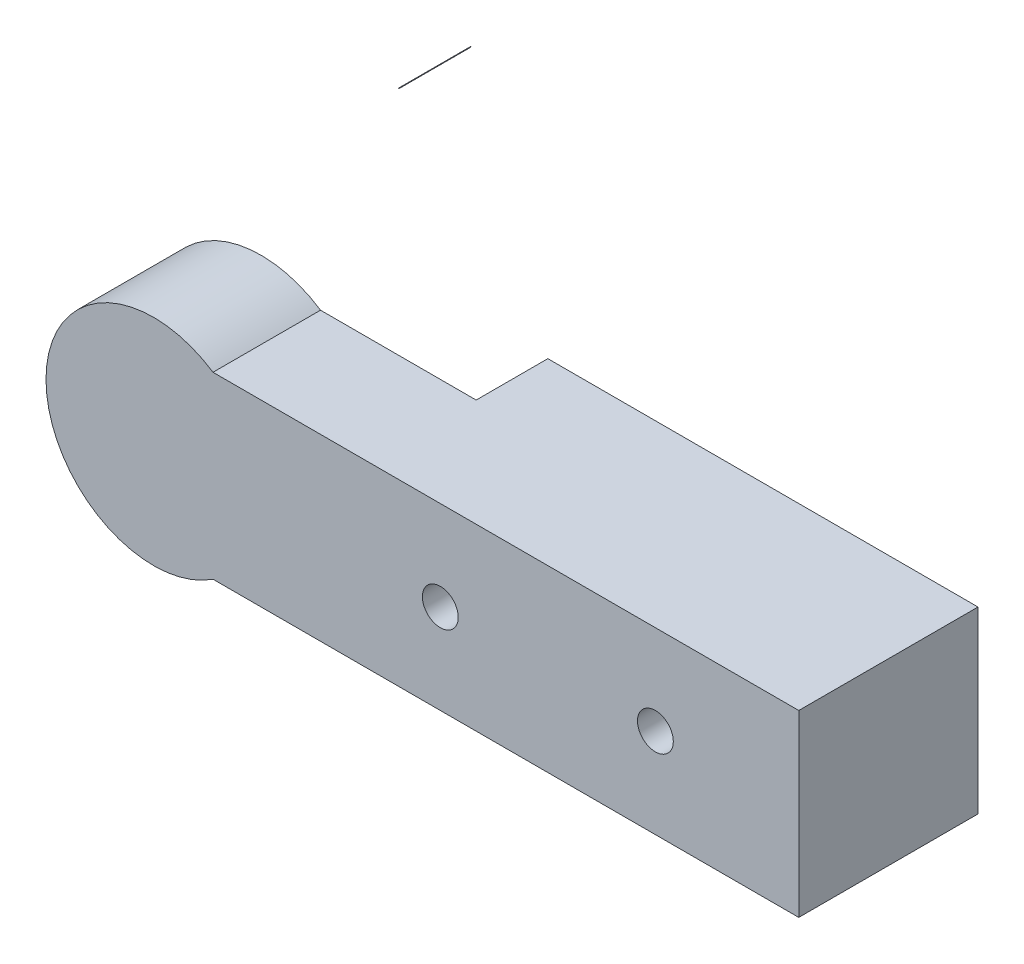
ISO-10303-21;
HEADER;
FILE_DESCRIPTION(('STEP AP214'),'2;1');
FILE_NAME('part.step','',(''),(''),'','','');
FILE_SCHEMA(('AUTOMOTIVE_DESIGN { 1 0 10303 214 1 1 1 1 }'));
ENDSEC;
DATA;
#1=APPLICATION_CONTEXT('core data for automotive mechanical design processes');
#2=APPLICATION_PROTOCOL_DEFINITION('international standard','automotive_design',2000,#1);
#3=PRODUCT_CONTEXT('',#1,'mechanical');
#4=PRODUCT('Part','Part','',(#3));
#5=PRODUCT_RELATED_PRODUCT_CATEGORY('part','',(#4));
#6=PRODUCT_DEFINITION_FORMATION('','',#4);
#7=PRODUCT_DEFINITION_CONTEXT('part definition',#1,'design');
#8=PRODUCT_DEFINITION('design','',#6,#7);
#9=PRODUCT_DEFINITION_SHAPE('','',#8);
#10=(LENGTH_UNIT() NAMED_UNIT(*) SI_UNIT(.MILLI.,.METRE.));
#11=(NAMED_UNIT(*) PLANE_ANGLE_UNIT() SI_UNIT($,.RADIAN.));
#12=(NAMED_UNIT(*) SI_UNIT($,.STERADIAN.) SOLID_ANGLE_UNIT());
#13=UNCERTAINTY_MEASURE_WITH_UNIT(LENGTH_MEASURE(1.E-05),#10,'distance_accuracy_value','');
#14=(GEOMETRIC_REPRESENTATION_CONTEXT(3) GLOBAL_UNCERTAINTY_ASSIGNED_CONTEXT((#13)) GLOBAL_UNIT_ASSIGNED_CONTEXT((#10,
#11,#12)) REPRESENTATION_CONTEXT('',''));
#15=CARTESIAN_POINT('',(0.,0.,0.));
#16=DIRECTION('',(0.,0.,1.));
#17=DIRECTION('',(1.,0.,0.));
#18=AXIS2_PLACEMENT_3D('',#15,#16,#17);
#19=CARTESIAN_POINT('',(19.2259292638255,44.7714350347894,-10.));
#20=DIRECTION('',(0.,0.,1.));
#21=DIRECTION('',(1.,0.,0.));
#22=AXIS2_PLACEMENT_3D('',#19,#20,#21);
#23=CYLINDRICAL_SURFACE('',#22,0.0357477974602727);
#24=CARTESIAN_POINT('',(19.2259292638255,44.7714350347894,-10.));
#25=DIRECTION('',(0.,0.,-1.));
#26=DIRECTION('',(-1.,0.,0.));
#27=AXIS2_PLACEMENT_3D('',#24,#25,#26);
#28=CIRCLE('',#27,0.0357477974602727);
#29=CARTESIAN_POINT('',(19.1901814663652,44.7714350347894,-10.));
#30=VERTEX_POINT('',#29);
#31=EDGE_CURVE('E11',#30,#30,#28,.T.);
#32=ORIENTED_EDGE('',*,*,#31,.F.);
#33=EDGE_LOOP('',(#32));
#34=FACE_BOUND('',#33,.T.);
#35=CARTESIAN_POINT('',(19.2259292638255,44.7714350347894,0.));
#36=DIRECTION('',(0.,0.,-1.));
#37=DIRECTION('',(-1.,0.,0.));
#38=AXIS2_PLACEMENT_3D('',#35,#36,#37);
#39=CIRCLE('',#38,0.0357477974602727);
#40=CARTESIAN_POINT('',(19.1901814663652,44.7714350347894,0.));
#41=VERTEX_POINT('',#40);
#42=EDGE_CURVE('E46',#41,#41,#39,.T.);
#43=ORIENTED_EDGE('',*,*,#42,.T.);
#44=EDGE_LOOP('',(#43));
#45=FACE_BOUND('',#44,.T.);
#46=ADVANCED_FACE('F43',(#34,#45),#23,.T.);
#47=CARTESIAN_POINT('',(19.2259292638255,44.7714350347894,-10.));
#48=DIRECTION('',(0.,0.,-1.));
#49=DIRECTION('',(-1.,0.,0.));
#50=AXIS2_PLACEMENT_3D('',#47,#48,#49);
#51=PLANE('',#50);
#52=ORIENTED_EDGE('',*,*,#31,.T.);
#53=EDGE_LOOP('',(#52));
#54=FACE_BOUND('',#53,.T.);
#55=ADVANCED_FACE('F58',(#54),#51,.T.);
#56=CARTESIAN_POINT('',(19.2259292638255,44.7714350347894,0.));
#57=DIRECTION('',(0.,0.,-1.));
#58=DIRECTION('',(-1.,0.,0.));
#59=AXIS2_PLACEMENT_3D('',#56,#57,#58);
#60=PLANE('',#59);
#61=ORIENTED_EDGE('',*,*,#42,.F.);
#62=EDGE_LOOP('',(#61));
#63=FACE_BOUND('',#62,.T.);
#64=ADVANCED_FACE('F56',(#63),#60,.F.);
#65=CLOSED_SHELL('',(#46,#55,#64));
#66=MANIFOLD_SOLID_BREP('B2',#65);
#67=CARTESIAN_POINT('',(0.,0.,0.));
#68=DIRECTION('',(0.,0.,1.));
#69=DIRECTION('',(1.,0.,0.));
#70=AXIS2_PLACEMENT_3D('',#67,#68,#69);
#71=PLANE('',#70);
#72=DIRECTION('',(0.,1.,0.));
#73=VECTOR('',#72,1.);
#74=CARTESIAN_POINT('',(30.,12.5,0.));
#75=LINE('',#74,#73);
#76=CARTESIAN_POINT('',(30.,-12.5,0.));
#77=VERTEX_POINT('',#76);
#78=CARTESIAN_POINT('',(30.,12.5,0.));
#79=VERTEX_POINT('',#78);
#80=EDGE_CURVE('E99',#77,#79,#75,.T.);
#81=ORIENTED_EDGE('',*,*,#80,.F.);
#82=DIRECTION('',(1.,0.,0.));
#83=VECTOR('',#82,1.);
#84=CARTESIAN_POINT('',(0.,-12.5,0.));
#85=LINE('',#84,#83);
#86=CARTESIAN_POINT('',(8.2915619758885,-12.5,0.));
#87=VERTEX_POINT('',#86);
#88=EDGE_CURVE('E193',#87,#77,#85,.T.);
#89=ORIENTED_EDGE('',*,*,#88,.F.);
#90=CARTESIAN_POINT('',(0.,0.,0.));
#91=DIRECTION('',(0.,0.,1.));
#92=DIRECTION('',(1.,0.,0.));
#93=AXIS2_PLACEMENT_3D('',#90,#91,#92);
#94=CIRCLE('',#93,15.);
#95=CARTESIAN_POINT('',(8.2915619758885,12.5,0.));
#96=VERTEX_POINT('',#95);
#97=EDGE_CURVE('E178',#96,#87,#94,.T.);
#98=ORIENTED_EDGE('',*,*,#97,.F.);
#99=DIRECTION('',(1.,0.,0.));
#100=VECTOR('',#99,1.);
#101=CARTESIAN_POINT('',(0.,12.5,0.));
#102=LINE('',#101,#100);
#103=EDGE_CURVE('E181',#96,#79,#102,.T.);
#104=ORIENTED_EDGE('',*,*,#103,.T.);
#105=EDGE_LOOP('',(#81,#89,#98,#104));
#106=FACE_BOUND('',#105,.T.);
#107=ADVANCED_FACE('F84',(#106),#71,.F.);
#108=CARTESIAN_POINT('',(0.,0.,15.));
#109=DIRECTION('',(0.,0.,-1.));
#110=DIRECTION('',(-1.,0.,0.));
#111=AXIS2_PLACEMENT_3D('',#108,#109,#110);
#112=CYLINDRICAL_SURFACE('',#111,15.);
#113=ORIENTED_EDGE('',*,*,#97,.T.);
#114=DIRECTION('',(0.,0.,-1.));
#115=VECTOR('',#114,1.);
#116=CARTESIAN_POINT('',(8.2915619758885,-12.5,15.));
#117=LINE('',#116,#115);
#118=CARTESIAN_POINT('',(8.2915619758885,-12.5,15.));
#119=VERTEX_POINT('',#118);
#120=EDGE_CURVE('E41',#119,#87,#117,.T.);
#121=ORIENTED_EDGE('',*,*,#120,.F.);
#122=CARTESIAN_POINT('',(0.,0.,15.));
#123=DIRECTION('',(0.,0.,1.));
#124=DIRECTION('',(1.,0.,0.));
#125=AXIS2_PLACEMENT_3D('',#122,#123,#124);
#126=CIRCLE('',#125,15.);
#127=CARTESIAN_POINT('',(8.2915619758885,12.5,15.));
#128=VERTEX_POINT('',#127);
#129=EDGE_CURVE('E179',#128,#119,#126,.T.);
#130=ORIENTED_EDGE('',*,*,#129,.F.);
#131=DIRECTION('',(0.,0.,-1.));
#132=VECTOR('',#131,1.);
#133=CARTESIAN_POINT('',(8.2915619758885,12.5,15.));
#134=LINE('',#133,#132);
#135=EDGE_CURVE('E108',#128,#96,#134,.T.);
#136=ORIENTED_EDGE('',*,*,#135,.T.);
#137=EDGE_LOOP('',(#113,#121,#130,#136));
#138=FACE_BOUND('',#137,.T.);
#139=ADVANCED_FACE('F86',(#138),#112,.T.);
#140=CARTESIAN_POINT('',(0.,-12.5,15.));
#141=DIRECTION('',(0.,1.,0.));
#142=DIRECTION('',(0.,0.,1.));
#143=AXIS2_PLACEMENT_3D('',#140,#141,#142);
#144=PLANE('',#143);
#145=ORIENTED_EDGE('',*,*,#88,.T.);
#146=DIRECTION('',(0.,0.,1.));
#147=VECTOR('',#146,1.);
#148=CARTESIAN_POINT('',(30.,-12.5,-10.));
#149=LINE('',#148,#147);
#150=CARTESIAN_POINT('',(30.,-12.5,-10.));
#151=VERTEX_POINT('',#150);
#152=EDGE_CURVE('E156',#151,#77,#149,.T.);
#153=ORIENTED_EDGE('',*,*,#152,.F.);
#154=DIRECTION('',(-1.,0.,0.));
#155=VECTOR('',#154,1.);
#156=CARTESIAN_POINT('',(90.,-12.5,-10.));
#157=LINE('',#156,#155);
#158=CARTESIAN_POINT('',(90.,-12.5,-10.));
#159=VERTEX_POINT('',#158);
#160=EDGE_CURVE('E153',#159,#151,#157,.T.);
#161=ORIENTED_EDGE('',*,*,#160,.F.);
#162=DIRECTION('',(0.,0.,-1.));
#163=VECTOR('',#162,1.);
#164=CARTESIAN_POINT('',(90.,-12.5,15.));
#165=LINE('',#164,#163);
#166=CARTESIAN_POINT('',(90.,-12.5,15.));
#167=VERTEX_POINT('',#166);
#168=EDGE_CURVE('E92',#167,#159,#165,.T.);
#169=ORIENTED_EDGE('',*,*,#168,.F.);
#170=DIRECTION('',(1.,0.,0.));
#171=VECTOR('',#170,1.);
#172=CARTESIAN_POINT('',(0.,-12.5,15.));
#173=LINE('',#172,#171);
#174=EDGE_CURVE('E127',#119,#167,#173,.T.);
#175=ORIENTED_EDGE('',*,*,#174,.F.);
#176=ORIENTED_EDGE('',*,*,#120,.T.);
#177=EDGE_LOOP('',(#145,#153,#161,#169,#175,#176));
#178=FACE_BOUND('',#177,.T.);
#179=ADVANCED_FACE('F154',(#178),#144,.F.);
#180=CARTESIAN_POINT('',(90.,0.,15.));
#181=DIRECTION('',(1.,0.,0.));
#182=DIRECTION('',(0.,0.,-1.));
#183=AXIS2_PLACEMENT_3D('',#180,#181,#182);
#184=PLANE('',#183);
#185=ORIENTED_EDGE('',*,*,#168,.T.);
#186=DIRECTION('',(0.,-1.,0.));
#187=VECTOR('',#186,1.);
#188=CARTESIAN_POINT('',(90.,12.5,-10.));
#189=LINE('',#188,#187);
#190=CARTESIAN_POINT('',(90.,12.5,-10.));
#191=VERTEX_POINT('',#190);
#192=EDGE_CURVE('E148',#191,#159,#189,.T.);
#193=ORIENTED_EDGE('',*,*,#192,.F.);
#194=DIRECTION('',(0.,0.,-1.));
#195=VECTOR('',#194,1.);
#196=CARTESIAN_POINT('',(90.,12.5,15.));
#197=LINE('',#196,#195);
#198=CARTESIAN_POINT('',(90.,12.5,15.));
#199=VERTEX_POINT('',#198);
#200=EDGE_CURVE('E151',#199,#191,#197,.T.);
#201=ORIENTED_EDGE('',*,*,#200,.F.);
#202=DIRECTION('',(0.,-1.,0.));
#203=VECTOR('',#202,1.);
#204=CARTESIAN_POINT('',(90.,0.,15.));
#205=LINE('',#204,#203);
#206=EDGE_CURVE('E150',#199,#167,#205,.T.);
#207=ORIENTED_EDGE('',*,*,#206,.T.);
#208=EDGE_LOOP('',(#185,#193,#201,#207));
#209=FACE_BOUND('',#208,.T.);
#210=ADVANCED_FACE('F146',(#209),#184,.T.);
#211=CARTESIAN_POINT('',(70.,0.,15.));
#212=DIRECTION('',(0.,0.,-1.));
#213=DIRECTION('',(-1.,0.,0.));
#214=AXIS2_PLACEMENT_3D('',#211,#212,#213);
#215=CYLINDRICAL_SURFACE('',#214,2.5);
#216=CARTESIAN_POINT('',(70.,0.,15.));
#217=DIRECTION('',(0.,0.,1.));
#218=DIRECTION('',(1.,0.,0.));
#219=AXIS2_PLACEMENT_3D('',#216,#217,#218);
#220=CIRCLE('',#219,2.5);
#221=CARTESIAN_POINT('',(72.5,0.,15.));
#222=VERTEX_POINT('',#221);
#223=EDGE_CURVE('E186',#222,#222,#220,.T.);
#224=ORIENTED_EDGE('',*,*,#223,.T.);
#225=EDGE_LOOP('',(#224));
#226=FACE_BOUND('',#225,.T.);
#227=CARTESIAN_POINT('',(70.,0.,-10.));
#228=DIRECTION('',(0.,0.,-1.));
#229=DIRECTION('',(-1.,0.,0.));
#230=AXIS2_PLACEMENT_3D('',#227,#228,#229);
#231=CIRCLE('',#230,2.5);
#232=CARTESIAN_POINT('',(67.5,0.,-10.));
#233=VERTEX_POINT('',#232);
#234=EDGE_CURVE('E167',#233,#233,#231,.T.);
#235=ORIENTED_EDGE('',*,*,#234,.T.);
#236=EDGE_LOOP('',(#235));
#237=FACE_BOUND('',#236,.T.);
#238=ADVANCED_FACE('F218',(#226,#237),#215,.F.);
#239=CARTESIAN_POINT('',(0.,12.5,15.));
#240=DIRECTION('',(0.,1.,0.));
#241=DIRECTION('',(-1.,0.,0.));
#242=AXIS2_PLACEMENT_3D('',#239,#240,#241);
#243=PLANE('',#242);
#244=ORIENTED_EDGE('',*,*,#103,.F.);
#245=ORIENTED_EDGE('',*,*,#135,.F.);
#246=DIRECTION('',(1.,0.,0.));
#247=VECTOR('',#246,1.);
#248=CARTESIAN_POINT('',(0.,12.5,15.));
#249=LINE('',#248,#247);
#250=EDGE_CURVE('E184',#128,#199,#249,.T.);
#251=ORIENTED_EDGE('',*,*,#250,.T.);
#252=ORIENTED_EDGE('',*,*,#200,.T.);
#253=DIRECTION('',(1.,0.,0.));
#254=VECTOR('',#253,1.);
#255=CARTESIAN_POINT('',(90.,12.5,-10.));
#256=LINE('',#255,#254);
#257=CARTESIAN_POINT('',(30.,12.5,-10.));
#258=VERTEX_POINT('',#257);
#259=EDGE_CURVE('E165',#258,#191,#256,.T.);
#260=ORIENTED_EDGE('',*,*,#259,.F.);
#261=DIRECTION('',(0.,0.,1.));
#262=VECTOR('',#261,1.);
#263=CARTESIAN_POINT('',(30.,12.5,-10.));
#264=LINE('',#263,#262);
#265=EDGE_CURVE('E173',#258,#79,#264,.T.);
#266=ORIENTED_EDGE('',*,*,#265,.T.);
#267=EDGE_LOOP('',(#244,#245,#251,#252,#260,#266));
#268=FACE_BOUND('',#267,.T.);
#269=ADVANCED_FACE('F197',(#268),#243,.T.);
#270=CARTESIAN_POINT('',(40.,0.,15.));
#271=DIRECTION('',(0.,0.,-1.));
#272=DIRECTION('',(-1.,0.,0.));
#273=AXIS2_PLACEMENT_3D('',#270,#271,#272);
#274=CYLINDRICAL_SURFACE('',#273,2.5);
#275=CARTESIAN_POINT('',(40.,0.,15.));
#276=DIRECTION('',(0.,0.,1.));
#277=DIRECTION('',(1.,0.,0.));
#278=AXIS2_PLACEMENT_3D('',#275,#276,#277);
#279=CIRCLE('',#278,2.5);
#280=CARTESIAN_POINT('',(42.5,0.,15.));
#281=VERTEX_POINT('',#280);
#282=EDGE_CURVE('E189',#281,#281,#279,.T.);
#283=ORIENTED_EDGE('',*,*,#282,.T.);
#284=EDGE_LOOP('',(#283));
#285=FACE_BOUND('',#284,.T.);
#286=CARTESIAN_POINT('',(40.,0.,-10.));
#287=DIRECTION('',(0.,0.,-1.));
#288=DIRECTION('',(-1.,0.,0.));
#289=AXIS2_PLACEMENT_3D('',#286,#287,#288);
#290=CIRCLE('',#289,2.5);
#291=CARTESIAN_POINT('',(37.5,0.,-10.));
#292=VERTEX_POINT('',#291);
#293=EDGE_CURVE('E313',#292,#292,#290,.T.);
#294=ORIENTED_EDGE('',*,*,#293,.T.);
#295=EDGE_LOOP('',(#294));
#296=FACE_BOUND('',#295,.T.);
#297=ADVANCED_FACE('F214',(#285,#296),#274,.F.);
#298=CARTESIAN_POINT('',(0.,0.,15.));
#299=DIRECTION('',(0.,0.,1.));
#300=DIRECTION('',(1.,0.,0.));
#301=AXIS2_PLACEMENT_3D('',#298,#299,#300);
#302=PLANE('',#301);
#303=ORIENTED_EDGE('',*,*,#129,.T.);
#304=ORIENTED_EDGE('',*,*,#174,.T.);
#305=ORIENTED_EDGE('',*,*,#206,.F.);
#306=ORIENTED_EDGE('',*,*,#250,.F.);
#307=EDGE_LOOP('',(#303,#304,#305,#306));
#308=FACE_BOUND('',#307,.T.);
#309=ORIENTED_EDGE('',*,*,#223,.F.);
#310=EDGE_LOOP('',(#309));
#311=FACE_BOUND('',#310,.T.);
#312=ORIENTED_EDGE('',*,*,#282,.F.);
#313=EDGE_LOOP('',(#312));
#314=FACE_BOUND('',#313,.T.);
#315=ADVANCED_FACE('F200',(#308,#311,#314),#302,.T.);
#316=CARTESIAN_POINT('',(0.,0.,-10.));
#317=DIRECTION('',(0.,0.,-1.));
#318=DIRECTION('',(-1.,0.,0.));
#319=AXIS2_PLACEMENT_3D('',#316,#317,#318);
#320=PLANE('',#319);
#321=ORIENTED_EDGE('',*,*,#234,.F.);
#322=EDGE_LOOP('',(#321));
#323=FACE_BOUND('',#322,.T.);
#324=ORIENTED_EDGE('',*,*,#192,.T.);
#325=ORIENTED_EDGE('',*,*,#160,.T.);
#326=DIRECTION('',(0.,1.,0.));
#327=VECTOR('',#326,1.);
#328=CARTESIAN_POINT('',(30.,12.5,-10.));
#329=LINE('',#328,#327);
#330=EDGE_CURVE('E159',#151,#258,#329,.T.);
#331=ORIENTED_EDGE('',*,*,#330,.T.);
#332=ORIENTED_EDGE('',*,*,#259,.T.);
#333=EDGE_LOOP('',(#324,#325,#331,#332));
#334=FACE_BOUND('',#333,.T.);
#335=ORIENTED_EDGE('',*,*,#293,.F.);
#336=EDGE_LOOP('',(#335));
#337=FACE_BOUND('',#336,.T.);
#338=ADVANCED_FACE('F162',(#323,#334,#337),#320,.T.);
#339=CARTESIAN_POINT('',(30.,12.5,-10.));
#340=DIRECTION('',(1.,0.,0.));
#341=DIRECTION('',(0.,1.,0.));
#342=AXIS2_PLACEMENT_3D('',#339,#340,#341);
#343=PLANE('',#342);
#344=ORIENTED_EDGE('',*,*,#80,.T.);
#345=ORIENTED_EDGE('',*,*,#265,.F.);
#346=ORIENTED_EDGE('',*,*,#330,.F.);
#347=ORIENTED_EDGE('',*,*,#152,.T.);
#348=EDGE_LOOP('',(#344,#345,#346,#347));
#349=FACE_BOUND('',#348,.T.);
#350=ADVANCED_FACE('F204',(#349),#343,.F.);
#351=CLOSED_SHELL('',(#107,#139,#179,#210,#238,#269,#297,#315,#338,#350));
#352=MANIFOLD_SOLID_BREP('B6',#351);
#353=ADVANCED_BREP_SHAPE_REPRESENTATION('',(#18,#66,#352),#14);
#354=SHAPE_DEFINITION_REPRESENTATION(#9,#353);
ENDSEC;
END-ISO-10303-21;
